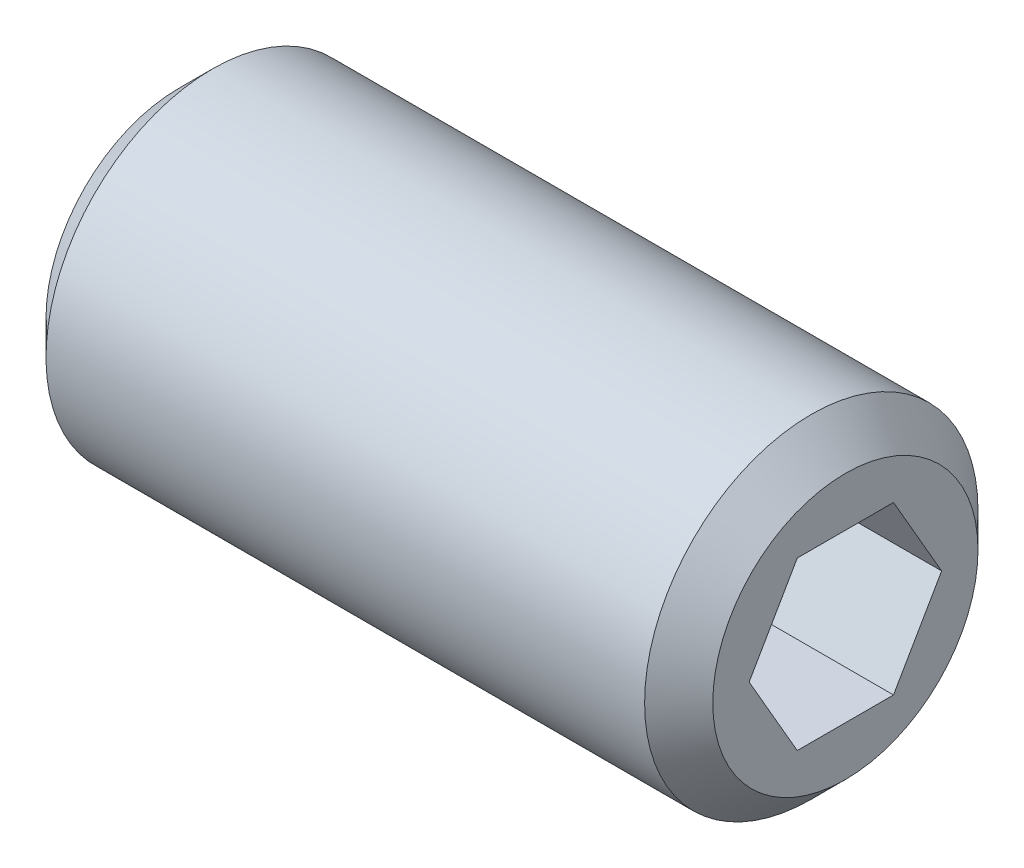
ISO-10303-21;
HEADER;
FILE_DESCRIPTION(('STEP AP214'),'2;1');
FILE_NAME('part.step','',(''),(''),'','','');
FILE_SCHEMA(('AUTOMOTIVE_DESIGN { 1 0 10303 214 1 1 1 1 }'));
ENDSEC;
DATA;
#1=APPLICATION_CONTEXT('core data for automotive mechanical design processes');
#2=APPLICATION_PROTOCOL_DEFINITION('international standard','automotive_design',2000,#1);
#3=PRODUCT_CONTEXT('',#1,'mechanical');
#4=PRODUCT('Part','Part','',(#3));
#5=PRODUCT_RELATED_PRODUCT_CATEGORY('part','',(#4));
#6=PRODUCT_DEFINITION_FORMATION('','',#4);
#7=PRODUCT_DEFINITION_CONTEXT('part definition',#1,'design');
#8=PRODUCT_DEFINITION('design','',#6,#7);
#9=PRODUCT_DEFINITION_SHAPE('','',#8);
#10=(LENGTH_UNIT() NAMED_UNIT(*) SI_UNIT(.MILLI.,.METRE.));
#11=(NAMED_UNIT(*) PLANE_ANGLE_UNIT() SI_UNIT($,.RADIAN.));
#12=(NAMED_UNIT(*) SI_UNIT($,.STERADIAN.) SOLID_ANGLE_UNIT());
#13=UNCERTAINTY_MEASURE_WITH_UNIT(LENGTH_MEASURE(1.E-05),#10,'distance_accuracy_value','');
#14=(GEOMETRIC_REPRESENTATION_CONTEXT(3) GLOBAL_UNCERTAINTY_ASSIGNED_CONTEXT((#13)) GLOBAL_UNIT_ASSIGNED_CONTEXT((#10,
#11,#12)) REPRESENTATION_CONTEXT('',''));
#15=CARTESIAN_POINT('',(0.,0.,0.));
#16=DIRECTION('',(0.,0.,1.));
#17=DIRECTION('',(1.,0.,0.));
#18=AXIS2_PLACEMENT_3D('',#15,#16,#17);
#19=CARTESIAN_POINT('',(6.,-0.749999999999995,0.433012701892216));
#20=DIRECTION('',(0.,-1.,0.));
#21=DIRECTION('',(0.,0.,-1.));
#22=AXIS2_PLACEMENT_3D('',#19,#20,#21);
#23=PLANE('',#22);
#24=DIRECTION('',(1.,0.,0.));
#25=VECTOR('',#24,1.);
#26=CARTESIAN_POINT('',(6.,-0.749999999999994,0.433012701892216));
#27=LINE('',#26,#25);
#28=CARTESIAN_POINT('',(4.00000000064663,-0.749999999919167,0.43301270184555));
#29=VERTEX_POINT('',#28);
#30=CARTESIAN_POINT('',(6.,-0.749999999999994,0.433012701892216));
#31=VERTEX_POINT('',#30);
#32=EDGE_CURVE('E77',#29,#31,#27,.T.);
#33=ORIENTED_EDGE('',*,*,#32,.T.);
#34=DIRECTION('',(0.,0.,-1.));
#35=VECTOR('',#34,1.);
#36=CARTESIAN_POINT('',(6.,-0.749999999999995,0.433012701892216));
#37=LINE('',#36,#35);
#38=CARTESIAN_POINT('',(6.,-0.749999999999994,-0.433012701892217));
#39=VERTEX_POINT('',#38);
#40=EDGE_CURVE('E83',#39,#31,#37,.F.);
#41=ORIENTED_EDGE('',*,*,#40,.F.);
#42=DIRECTION('',(1.,0.,0.));
#43=VECTOR('',#42,1.);
#44=CARTESIAN_POINT('',(6.,-0.749999999999994,-0.433012701892217));
#45=LINE('',#44,#43);
#46=CARTESIAN_POINT('',(4.00000000067357,-0.749999999999995,-0.433012701798885));
#47=VERTEX_POINT('',#46);
#48=EDGE_CURVE('E80',#39,#47,#45,.F.);
#49=ORIENTED_EDGE('',*,*,#48,.T.);
#50=CARTESIAN_POINT('',(4.00000000056839,-0.750000000129454,0.433012701728138));
#51=CARTESIAN_POINT('',(3.98901082886779,-0.750000000046491,0.394956130306231));
#52=CARTESIAN_POINT('',(3.97901675324587,-0.750000000012457,0.35657105488297));
#53=CARTESIAN_POINT('',(3.96157239504089,-0.749999999987504,0.27913629198152));
#54=CARTESIAN_POINT('',(3.95412828293885,-0.749999999996688,0.240085229084931));
#55=CARTESIAN_POINT('',(3.94254098529215,-0.75000000000322,0.162467043694572));
#56=CARTESIAN_POINT('',(3.93832067088142,-0.750000000000855,0.123911860404876));
#57=CARTESIAN_POINT('',(3.93328343847129,-0.749999999999136,0.0466201735602444));
#58=CARTESIAN_POINT('',(3.93246234820697,-0.74999999999978,0.00788395074685964));
#59=CARTESIAN_POINT('',(3.93417485931823,-0.750000000000183,-0.064490526009888));
#60=CARTESIAN_POINT('',(3.9362879824676,-0.750000000000046,-0.0981396403346065));
#61=CARTESIAN_POINT('',(3.94298398829674,-0.749999999999944,-0.16521865598123));
#62=CARTESIAN_POINT('',(3.94756915608032,-0.74999999999998,-0.198648325467897));
#63=CARTESIAN_POINT('',(3.95903118807331,-0.75000000000001,-0.26586553021408));
#64=CARTESIAN_POINT('',(3.96595661641819,-0.750000000000003,-0.299644562520736));
#65=CARTESIAN_POINT('',(3.98167441093247,-0.749999999999988,-0.366698958579552));
#66=CARTESIAN_POINT('',(3.99046308641625,-0.74999999999998,-0.399975180713371));
#67=CARTESIAN_POINT('',(4.00000000065257,-0.749999999999995,-0.433012701726143));
#68=B_SPLINE_CURVE_WITH_KNOTS('',3,(#50,#51,#52,#53,#54,#55,#56,#57,#58,#59,#60,#61,#62,#63,#64,
#65,#66,#67),.UNSPECIFIED.,.F.,.F.,(4,2,2,2,2,2,2,2,4),(0.,0.118881004394453,0.238047681515909,
0.354265352456235,0.470340333501576,0.571390418553876,0.672534072642849,0.775920608313071,
0.879104239856018),.UNSPECIFIED.);
#69=EDGE_CURVE('E21',#29,#47,#68,.T.);
#70=ORIENTED_EDGE('',*,*,#69,.F.);
#71=EDGE_LOOP('',(#33,#41,#49,#70));
#72=FACE_BOUND('',#71,.T.);
#73=ADVANCED_FACE('F17',(#72),#23,.F.);
#74=CARTESIAN_POINT('',(6.,0.,0.866025403784433));
#75=DIRECTION('',(0.,-0.500000000000001,0.866025403784438));
#76=DIRECTION('',(0.,-0.866025403784438,-0.500000000000001));
#77=AXIS2_PLACEMENT_3D('',#74,#75,#76);
#78=PLANE('',#77);
#79=DIRECTION('',(1.,0.,0.));
#80=VECTOR('',#79,1.);
#81=CARTESIAN_POINT('',(6.,0.,0.866025403784433));
#82=LINE('',#81,#80);
#83=CARTESIAN_POINT('',(4.00000000067344,-8.1227557894121E-11,0.866025403737536));
#84=VERTEX_POINT('',#83);
#85=CARTESIAN_POINT('',(6.,0.,0.866025403784433));
#86=VERTEX_POINT('',#85);
#87=EDGE_CURVE('E154',#84,#86,#82,.T.);
#88=ORIENTED_EDGE('',*,*,#87,.T.);
#89=DIRECTION('',(0.,-0.866025403784438,-0.500000000000001));
#90=VECTOR('',#89,1.);
#91=CARTESIAN_POINT('',(6.,0.,0.866025403784433));
#92=LINE('',#91,#90);
#93=EDGE_CURVE('E93',#31,#86,#92,.F.);
#94=ORIENTED_EDGE('',*,*,#93,.F.);
#95=ORIENTED_EDGE('',*,*,#32,.F.);
#96=CARTESIAN_POINT('',(4.00000000056852,-2.0739899990691E-10,0.866025403813427));
#97=CARTESIAN_POINT('',(3.98901082886767,-0.0329579577983956,0.846997118031008));
#98=CARTESIAN_POINT('',(3.97901675324567,-0.0662004082241855,0.827804580290054));
#99=CARTESIAN_POINT('',(3.96157239504064,-0.133260880020468,0.789087198817818));
#100=CARTESIAN_POINT('',(3.95412828293865,-0.167080092538289,0.769561667377425));
#101=CARTESIAN_POINT('',(3.94254098529203,-0.234299412885267,0.730752574687858));
#102=CARTESIAN_POINT('',(3.93832067088132,-0.26768918106054,0.711474983040967));
#103=CARTESIAN_POINT('',(3.93328343847124,-0.334625745368504,0.672829139617161));
#104=CARTESIAN_POINT('',(3.93246234820696,-0.368172298371879,0.653461028211018));
#105=CARTESIAN_POINT('',(3.93417485931828,-0.430850433828956,0.617273789833033));
#106=CARTESIAN_POINT('',(3.93628798246767,-0.45999142164886,0.600449232670603));
#107=CARTESIAN_POINT('',(3.94298398829683,-0.518083553259476,0.566909724847298));
#108=CARTESIAN_POINT('',(3.94756915608042,-0.547034496274984,0.550194890104043));
#109=CARTESIAN_POINT('',(3.9590311880734,-0.60524630315641,0.51658628773107));
#110=CARTESIAN_POINT('',(3.96595661641827,-0.634499803249144,0.499696771577783));
#111=CARTESIAN_POINT('',(3.98167441093252,-0.692570613671336,0.466169573548453));
#112=CARTESIAN_POINT('',(3.99046308641627,-0.721388667381116,0.449531462481582));
#113=CARTESIAN_POINT('',(4.00000000065257,-0.749999999856171,0.433012701975252));
#114=B_SPLINE_CURVE_WITH_KNOTS('',3,(#96,#97,#98,#99,#100,#101,#102,#103,#104,#105,#106,#107,
#108,#109,#110,#111,#112,#113),.UNSPECIFIED.,.F.,.F.,(4,2,2,2,2,2,2,2,4),(0.,0.118881004394505,
0.238047681515997,0.354265352456344,0.470340333501712,0.571390418553738,0.672534072642432,
0.775920608312373,0.879104239855045),.UNSPECIFIED.);
#115=EDGE_CURVE('E85',#84,#29,#114,.T.);
#116=ORIENTED_EDGE('',*,*,#115,.F.);
#117=EDGE_LOOP('',(#88,#94,#95,#116));
#118=FACE_BOUND('',#117,.T.);
#119=ADVANCED_FACE('F94',(#118),#78,.F.);
#120=CARTESIAN_POINT('',(6.,-0.749999999999994,-0.433012701892217));
#121=DIRECTION('',(0.,-0.5,-0.866025403784439));
#122=DIRECTION('',(0.,0.866025403784439,-0.5));
#123=AXIS2_PLACEMENT_3D('',#120,#121,#122);
#124=PLANE('',#123);
#125=ORIENTED_EDGE('',*,*,#48,.F.);
#126=DIRECTION('',(0.,0.866025403784439,-0.5));
#127=VECTOR('',#126,1.);
#128=CARTESIAN_POINT('',(6.,-0.749999999999994,-0.433012701892217));
#129=LINE('',#128,#127);
#130=CARTESIAN_POINT('',(6.,0.,-0.866025403784433));
#131=VERTEX_POINT('',#130);
#132=EDGE_CURVE('E92',#131,#39,#129,.F.);
#133=ORIENTED_EDGE('',*,*,#132,.F.);
#134=DIRECTION('',(1.,0.,0.));
#135=VECTOR('',#134,1.);
#136=CARTESIAN_POINT('',(6.,0.,-0.866025403784433));
#137=LINE('',#136,#135);
#138=CARTESIAN_POINT('',(3.99999999682911,-1.16142112846111E-08,-0.866025397078965));
#139=VERTEX_POINT('',#138);
#140=EDGE_CURVE('E214',#131,#139,#137,.F.);
#141=ORIENTED_EDGE('',*,*,#140,.T.);
#142=CARTESIAN_POINT('',(4.00000000056839,-0.749999999922628,-0.433012702086371));
#143=CARTESIAN_POINT('',(3.98901082887053,-0.717042042257173,-0.452040987720664));
#144=CARTESIAN_POINT('',(3.9790167532509,-0.683799591805867,-0.471233525397949));
#145=CARTESIAN_POINT('',(3.96157239504932,-0.616739120002906,-0.509950906816558));
#146=CARTESIAN_POINT('',(3.95412828294832,-0.582919907504043,-0.529476438267164));
#147=CARTESIAN_POINT('',(3.9425409852984,-0.515700587165081,-0.56828553096715));
#148=CARTESIAN_POINT('',(3.9383206708851,-0.482310818978927,-0.587563122614873));
#149=CARTESIAN_POINT('',(3.93328343847188,-0.415374254650662,-0.626208966046441));
#150=CARTESIAN_POINT('',(3.93246234820713,-0.381827701637861,-0.645577077459509));
#151=CARTESIAN_POINT('',(3.9341748592587,-0.319149568338187,-0.681764314592844));
#152=CARTESIAN_POINT('',(3.93628798215258,-0.290008582680571,-0.698588870506562));
#153=CARTESIAN_POINT('',(3.94298398711925,-0.231916455358769,-0.732128375853485));
#154=CARTESIAN_POINT('',(3.94756915429503,-0.202965514469703,-0.748843209369122));
#155=CARTESIAN_POINT('',(3.95903118477247,-0.144753711890339,-0.782451809258365));
#156=CARTESIAN_POINT('',(3.96595661219865,-0.115500213971113,-0.79934132415676));
#157=CARTESIAN_POINT('',(3.98167440467572,-0.0574294078168573,-0.832868519721961));
#158=CARTESIAN_POINT('',(3.9904630790422,-0.0286113562017905,-0.849506629579432));
#159=CARTESIAN_POINT('',(3.99999999210315,-2.57920976005557E-08,-0.866025388893358));
#160=B_SPLINE_CURVE_WITH_KNOTS('',3,(#142,#143,#144,#145,#146,#147,#148,#149,#150,#151,#152,
#153,#154,#155,#156,#157,#158,#159),.UNSPECIFIED.,.F.,.F.,(4,2,2,2,2,2,2,2,4),(0.,
0.118881004364489,0.238047681452131,0.354265352422942,0.470340333501561,0.571390411052098,
0.672534057611554,0.775920585361256,0.87910420904399),.UNSPECIFIED.);
#161=EDGE_CURVE('E149',#47,#139,#160,.T.);
#162=ORIENTED_EDGE('',*,*,#161,.F.);
#163=EDGE_LOOP('',(#125,#133,#141,#162));
#164=FACE_BOUND('',#163,.T.);
#165=ADVANCED_FACE('F155',(#164),#124,.F.);
#166=CARTESIAN_POINT('',(6.,0.749999999999995,0.433012701892217));
#167=DIRECTION('',(0.,0.5,0.866025403784439));
#168=DIRECTION('',(0.,-0.866025403784439,0.5));
#169=AXIS2_PLACEMENT_3D('',#166,#167,#168);
#170=PLANE('',#169);
#171=DIRECTION('',(1.,0.,0.));
#172=VECTOR('',#171,1.);
#173=CARTESIAN_POINT('',(6.,0.749999999999996,0.433012701892217));
#174=LINE('',#173,#172);
#175=CARTESIAN_POINT('',(3.9999999929577,0.749999962427322,0.433012740148115));
#176=VERTEX_POINT('',#175);
#177=CARTESIAN_POINT('',(6.,0.749999999999996,0.433012701892217));
#178=VERTEX_POINT('',#177);
#179=EDGE_CURVE('E207',#176,#178,#174,.T.);
#180=ORIENTED_EDGE('',*,*,#179,.T.);
#181=DIRECTION('',(0.,-0.866025403784439,0.5));
#182=VECTOR('',#181,1.);
#183=CARTESIAN_POINT('',(6.,0.749999999999995,0.433012701892217));
#184=LINE('',#183,#182);
#185=EDGE_CURVE('E220',#86,#178,#184,.F.);
#186=ORIENTED_EDGE('',*,*,#185,.F.);
#187=ORIENTED_EDGE('',*,*,#87,.F.);
#188=CARTESIAN_POINT('',(4.00000000056852,2.07399510563023E-10,0.866025403813427));
#189=CARTESIAN_POINT('',(3.98901082887569,0.032957957774031,0.846997118045075));
#190=CARTESIAN_POINT('',(3.97901675326036,0.0662004081751536,0.827804580318362));
#191=CARTESIAN_POINT('',(3.9615723950653,0.133260879918241,0.789087198876839));
#192=CARTESIAN_POINT('',(3.95412828296635,0.167080092407486,0.769561667452944));
#193=CARTESIAN_POINT('',(3.94254098531031,0.23429941275016,0.730752574765863));
#194=CARTESIAN_POINT('',(3.93832067089208,0.267689180950366,0.711474983104577));
#195=CARTESIAN_POINT('',(3.93328343847298,0.334625745312716,0.672829139649371));
#196=CARTESIAN_POINT('',(3.93246234820742,0.368172298345553,0.653461028226217));
#197=CARTESIAN_POINT('',(3.93417485914424,0.430850427496411,0.617273793489131));
#198=CARTESIAN_POINT('',(3.93628798154671,0.459991408994219,0.600449239976764));
#199=CARTESIAN_POINT('',(3.94298398485445,0.518083528065694,0.566909739392936));
#200=CARTESIAN_POINT('',(3.9475691508611,0.547034464864405,0.550194908238949));
#201=CARTESIAN_POINT('',(3.9590311784234,0.605246259168339,0.516586313127596));
#202=CARTESIAN_POINT('',(3.96595660408243,0.63449975290655,0.499696800643094));
#203=CARTESIAN_POINT('',(3.98167439264086,0.692570550850902,0.466169609817849));
#204=CARTESIAN_POINT('',(3.99046306485821,0.721388598436529,0.44953150228676));
#205=CARTESIAN_POINT('',(3.99999997565828,0.749999924873308,0.43301274526663));
#206=B_SPLINE_CURVE_WITH_KNOTS('',3,(#188,#189,#190,#191,#192,#193,#194,#195,#196,#197,#198,
#199,#200,#201,#202,#203,#204,#205),.UNSPECIFIED.,.F.,.F.,(4,2,2,2,2,2,2,2,4),(0.,
0.118881004306903,0.238047681329544,0.354265352359012,0.470340333501668,0.57139039662225,
0.672534028698361,0.77592054121262,0.879104149775919),.UNSPECIFIED.);
#207=EDGE_CURVE('E88',#84,#176,#206,.T.);
#208=ORIENTED_EDGE('',*,*,#207,.T.);
#209=EDGE_LOOP('',(#180,#186,#187,#208));
#210=FACE_BOUND('',#209,.T.);
#211=ADVANCED_FACE('F158',(#210),#170,.F.);
#212=CARTESIAN_POINT('',(6.,0.,-0.866025403784433));
#213=DIRECTION('',(0.,0.500000000000001,-0.866025403784438));
#214=DIRECTION('',(0.,0.866025403784438,0.500000000000001));
#215=AXIS2_PLACEMENT_3D('',#212,#213,#214);
#216=PLANE('',#215);
#217=ORIENTED_EDGE('',*,*,#140,.F.);
#218=DIRECTION('',(0.,0.866025403784438,0.500000000000001));
#219=VECTOR('',#218,1.);
#220=CARTESIAN_POINT('',(6.,0.,-0.866025403784433));
#221=LINE('',#220,#219);
#222=CARTESIAN_POINT('',(6.,0.749999999999996,-0.433012701892216));
#223=VERTEX_POINT('',#222);
#224=EDGE_CURVE('E40',#223,#131,#221,.F.);
#225=ORIENTED_EDGE('',*,*,#224,.F.);
#226=DIRECTION('',(1.,0.,0.));
#227=VECTOR('',#226,1.);
#228=CARTESIAN_POINT('',(6.,0.749999999999996,-0.433012701892216));
#229=LINE('',#228,#227);
#230=CARTESIAN_POINT('',(3.99999998817751,0.749999962430986,-0.433012723582694));
#231=VERTEX_POINT('',#230);
#232=EDGE_CURVE('E121',#223,#231,#229,.F.);
#233=ORIENTED_EDGE('',*,*,#232,.T.);
#234=CARTESIAN_POINT('',(3.99999997557423,0.749999924948459,-0.433012745376618));
#235=CARTESIAN_POINT('',(3.98901080592247,0.717041968522678,-0.452041030292692));
#236=CARTESIAN_POINT('',(3.97901673247713,0.683799519319693,-0.471233567248235));
#237=CARTESIAN_POINT('',(3.96157237879137,0.61673905013541,-0.5099509471542));
#238=CARTESIAN_POINT('',(3.95412826902931,0.582919839007669,-0.529476477813464));
#239=CARTESIAN_POINT('',(3.94254097601885,0.515700521408239,-0.568285568931976));
#240=CARTESIAN_POINT('',(3.93832066391524,0.48231075458559,-0.58756315979241));
#241=CARTESIAN_POINT('',(3.9332834359606,0.415374193143922,-0.626209001557348));
#242=CARTESIAN_POINT('',(3.93246234784638,0.381827641653914,-0.645577112091251));
#243=CARTESIAN_POINT('',(3.93417486246871,0.319149514720845,-0.681764345548837));
#244=CARTESIAN_POINT('',(3.93628798652495,0.290008533881538,-0.698588898680698));
#245=CARTESIAN_POINT('',(3.94298399288569,0.231916416211998,-0.732128398454883));
#246=CARTESIAN_POINT('',(3.94756916029114,0.20296548015678,-0.748843229179697));
#247=CARTESIAN_POINT('',(3.95903119036973,0.144753687417072,-0.782451823388014));
#248=CARTESIAN_POINT('',(3.96595661713735,0.115500194500016,-0.799341335398404));
#249=CARTESIAN_POINT('',(3.98167440761073,0.0574293981960242,-0.832868525276552));
#250=CARTESIAN_POINT('',(3.99046308063484,0.0286113514295734,-0.849506632334673));
#251=CARTESIAN_POINT('',(3.99999999210315,2.57920982434831E-08,-0.866025388893359));
#252=B_SPLINE_CURVE_WITH_KNOTS('',3,(#234,#235,#236,#237,#238,#239,#240,#241,#242,#243,#244,
#245,#246,#247,#248,#249,#250,#251),.UNSPECIFIED.,.F.,.F.,(4,2,2,2,2,2,2,2,4),(0.,
0.118880998523852,0.238047669619846,0.354265335139914,0.470340310824284,0.571390371991829,
0.672534002105056,0.775920512516974,0.879104118972661),.UNSPECIFIED.);
#253=EDGE_CURVE('E145',#231,#139,#252,.T.);
#254=ORIENTED_EDGE('',*,*,#253,.T.);
#255=EDGE_LOOP('',(#217,#225,#233,#254));
#256=FACE_BOUND('',#255,.T.);
#257=ADVANCED_FACE('F133',(#256),#216,.F.);
#258=CARTESIAN_POINT('',(4.00300000052312,0.,0.));
#259=DIRECTION('',(1.,0.,0.));
#260=DIRECTION('',(0.,0.,-1.));
#261=AXIS2_PLACEMENT_3D('',#258,#259,#260);
#262=CONICAL_SURFACE('',#261,0.871221555883039,1.04719754979303);
#263=CARTESIAN_POINT('',(3.49999999923511,-1.13686837721616E-10,0.));
#264=VERTEX_POINT('',#263);
#265=VERTEX_LOOP('',#264);
#266=FACE_BOUND('',#265,.T.);
#267=ORIENTED_EDGE('',*,*,#207,.F.);
#268=ORIENTED_EDGE('',*,*,#115,.T.);
#269=ORIENTED_EDGE('',*,*,#69,.T.);
#270=ORIENTED_EDGE('',*,*,#161,.T.);
#271=ORIENTED_EDGE('',*,*,#253,.F.);
#272=CARTESIAN_POINT('',(4.00000003283745,0.749999962642566,-0.433012728493074));
#273=CARTESIAN_POINT('',(3.98901084511361,0.749999986582881,-0.394956158187976));
#274=CARTESIAN_POINT('',(3.97901676216525,0.749999996403983,-0.356571081609232));
#275=CARTESIAN_POINT('',(3.96157239722279,0.75000000360465,-0.279136314557278));
#276=CARTESIAN_POINT('',(3.95412828571377,0.75000000095426,-0.240085248664037));
#277=CARTESIAN_POINT('',(3.94254098760668,0.749999999069347,-0.162467058226651));
#278=CARTESIAN_POINT('',(3.93832067215031,0.749999999751914,-0.123911872881106));
#279=CARTESIAN_POINT('',(3.93328343854336,0.750000000247773,-0.046620181642429));
#280=CARTESIAN_POINT('',(3.9324623481351,0.75000000006213,-0.00788395649051985));
#281=CARTESIAN_POINT('',(3.93417485924032,0.749999999945904,0.0644905250820988));
#282=CARTESIAN_POINT('',(3.93628798253244,0.749999999985416,0.0981396418880965));
#283=CARTESIAN_POINT('',(3.94298398902899,0.750000000014589,0.165218662411522));
#284=CARTESIAN_POINT('',(3.94756915733379,0.750000000004204,0.198648334294062));
#285=CARTESIAN_POINT('',(3.95903119070589,0.749999999995695,0.265865544141695));
#286=CARTESIAN_POINT('',(3.96595661993631,0.749999999997847,0.299644579148619));
#287=CARTESIAN_POINT('',(3.9816744164719,0.75000000000214,0.366698980594805));
#288=CARTESIAN_POINT('',(3.99046309309479,0.75000000000428,0.399975205414992));
#289=CARTESIAN_POINT('',(4.000000008548,0.749999999999996,0.433012729076723));
#290=B_SPLINE_CURVE_WITH_KNOTS('',3,(#272,#273,#274,#275,#276,#277,#278,#279,#280,#281,#282,
#283,#284,#285,#286,#287,#288,#289),.UNSPECIFIED.,.F.,.F.,(4,2,2,2,2,2,2,2,4),(0.,
0.118881013226639,0.238047698512004,0.354265376089197,0.470340364048798,0.571390456558519,
0.672534117956745,0.77592066208728,0.879104302282672),.UNSPECIFIED.);
#291=EDGE_CURVE('E115',#231,#176,#290,.T.);
#292=ORIENTED_EDGE('',*,*,#291,.T.);
#293=EDGE_LOOP('',(#267,#268,#269,#270,#271,#292));
#294=FACE_BOUND('',#293,.T.);
#295=ADVANCED_FACE('F86',(#266,#294),#262,.F.);
#296=CARTESIAN_POINT('',(6.,0.749999999999996,-0.433012701892216));
#297=DIRECTION('',(0.,1.,0.));
#298=DIRECTION('',(0.,0.,1.));
#299=AXIS2_PLACEMENT_3D('',#296,#297,#298);
#300=PLANE('',#299);
#301=ORIENTED_EDGE('',*,*,#232,.F.);
#302=DIRECTION('',(0.,0.,1.));
#303=VECTOR('',#302,1.);
#304=CARTESIAN_POINT('',(6.,0.749999999999996,0.));
#305=LINE('',#304,#303);
#306=EDGE_CURVE('E114',#223,#178,#305,.T.);
#307=ORIENTED_EDGE('',*,*,#306,.T.);
#308=ORIENTED_EDGE('',*,*,#179,.F.);
#309=ORIENTED_EDGE('',*,*,#291,.F.);
#310=EDGE_LOOP('',(#301,#307,#308,#309));
#311=FACE_BOUND('',#310,.T.);
#312=ADVANCED_FACE('F127',(#311),#300,.F.);
#313=CARTESIAN_POINT('',(6.,0.,0.));
#314=DIRECTION('',(-1.,0.,0.));
#315=DIRECTION('',(0.,0.,1.));
#316=AXIS2_PLACEMENT_3D('',#313,#314,#315);
#317=PLANE('',#316);
#318=ORIENTED_EDGE('',*,*,#224,.T.);
#319=ORIENTED_EDGE('',*,*,#132,.T.);
#320=ORIENTED_EDGE('',*,*,#40,.T.);
#321=ORIENTED_EDGE('',*,*,#93,.T.);
#322=ORIENTED_EDGE('',*,*,#185,.T.);
#323=ORIENTED_EDGE('',*,*,#306,.F.);
#324=EDGE_LOOP('',(#318,#319,#320,#321,#322,#323));
#325=FACE_BOUND('',#324,.T.);
#326=CARTESIAN_POINT('',(6.00000000014234,0.,0.));
#327=DIRECTION('',(-1.,0.,0.));
#328=DIRECTION('',(0.,0.,1.));
#329=AXIS2_PLACEMENT_3D('',#326,#327,#328);
#330=CIRCLE('',#329,1.19327500010513);
#331=CARTESIAN_POINT('',(6.00000000014234,0.,1.19327500010513));
#332=VERTEX_POINT('',#331);
#333=EDGE_CURVE('E111',#332,#332,#330,.T.);
#334=ORIENTED_EDGE('',*,*,#333,.F.);
#335=EDGE_LOOP('',(#334));
#336=FACE_BOUND('',#335,.T.);
#337=ADVANCED_FACE('F185',(#325,#336),#317,.F.);
#338=CARTESIAN_POINT('',(0.,0.75,0.));
#339=DIRECTION('',(-1.,0.,0.));
#340=DIRECTION('',(0.,0.,1.));
#341=AXIS2_PLACEMENT_3D('',#338,#339,#340);
#342=PLANE('',#341);
#343=CARTESIAN_POINT('',(-1.13686946141833E-10,0.,0.));
#344=DIRECTION('',(1.,0.,0.));
#345=DIRECTION('',(0.,1.,0.));
#346=AXIS2_PLACEMENT_3D('',#343,#344,#345);
#347=CIRCLE('',#346,1.19327500010513);
#348=CARTESIAN_POINT('',(-1.13687053954446E-10,1.19327500010513,0.));
#349=VERTEX_POINT('',#348);
#350=EDGE_CURVE('E108',#349,#349,#347,.T.);
#351=ORIENTED_EDGE('',*,*,#350,.F.);
#352=EDGE_LOOP('',(#351));
#353=FACE_BOUND('',#352,.T.);
#354=ADVANCED_FACE('F182',(#353),#342,.T.);
#355=CARTESIAN_POINT('',(5.69327499982819,0.,0.));
#356=DIRECTION('',(-1.,0.,0.));
#357=DIRECTION('',(0.,0.,1.));
#358=AXIS2_PLACEMENT_3D('',#355,#356,#357);
#359=CONICAL_SURFACE('',#358,1.49999999990769,0.785398162563492);
#360=ORIENTED_EDGE('',*,*,#333,.T.);
#361=EDGE_LOOP('',(#360));
#362=FACE_BOUND('',#361,.T.);
#363=CARTESIAN_POINT('',(5.693275,0.,0.));
#364=DIRECTION('',(1.,0.,0.));
#365=DIRECTION('',(0.,1.,0.));
#366=AXIS2_PLACEMENT_3D('',#363,#364,#365);
#367=CIRCLE('',#366,1.5);
#368=CARTESIAN_POINT('',(5.693275,1.5,0.));
#369=VERTEX_POINT('',#368);
#370=EDGE_CURVE('E31',#369,#369,#367,.F.);
#371=ORIENTED_EDGE('',*,*,#370,.F.);
#372=EDGE_LOOP('',(#371));
#373=FACE_BOUND('',#372,.T.);
#374=ADVANCED_FACE('F175',(#362,#373),#359,.T.);
#375=CARTESIAN_POINT('',(0.306725000200458,0.,0.));
#376=DIRECTION('',(1.,0.,0.));
#377=DIRECTION('',(0.,1.,0.));
#378=AXIS2_PLACEMENT_3D('',#375,#376,#377);
#379=CONICAL_SURFACE('',#378,1.49999999990769,0.785398162563492);
#380=CARTESIAN_POINT('',(0.306725,0.,0.));
#381=DIRECTION('',(1.,0.,0.));
#382=DIRECTION('',(0.,1.,0.));
#383=AXIS2_PLACEMENT_3D('',#380,#381,#382);
#384=CIRCLE('',#383,1.5);
#385=CARTESIAN_POINT('',(0.306725,1.5,0.));
#386=VERTEX_POINT('',#385);
#387=EDGE_CURVE('E11',#386,#386,#384,.T.);
#388=ORIENTED_EDGE('',*,*,#387,.F.);
#389=EDGE_LOOP('',(#388));
#390=FACE_BOUND('',#389,.T.);
#391=ORIENTED_EDGE('',*,*,#350,.T.);
#392=EDGE_LOOP('',(#391));
#393=FACE_BOUND('',#392,.T.);
#394=ADVANCED_FACE('F169',(#390,#393),#379,.T.);
#395=CARTESIAN_POINT('',(3.,0.,0.));
#396=DIRECTION('',(1.,0.,0.));
#397=DIRECTION('',(0.,1.,0.));
#398=AXIS2_PLACEMENT_3D('',#395,#396,#397);
#399=CYLINDRICAL_SURFACE('',#398,1.5);
#400=ORIENTED_EDGE('',*,*,#387,.T.);
#401=EDGE_LOOP('',(#400));
#402=FACE_BOUND('',#401,.T.);
#403=ORIENTED_EDGE('',*,*,#370,.T.);
#404=EDGE_LOOP('',(#403));
#405=FACE_BOUND('',#404,.T.);
#406=ADVANCED_FACE('F167',(#402,#405),#399,.T.);
#407=CLOSED_SHELL('',(#73,#119,#165,#211,#257,#295,#312,#337,#354,#374,#394,#406));
#408=MANIFOLD_SOLID_BREP('B1',#407);
#409=ADVANCED_BREP_SHAPE_REPRESENTATION('',(#18,#408),#14);
#410=SHAPE_DEFINITION_REPRESENTATION(#9,#409);
ENDSEC;
END-ISO-10303-21;
